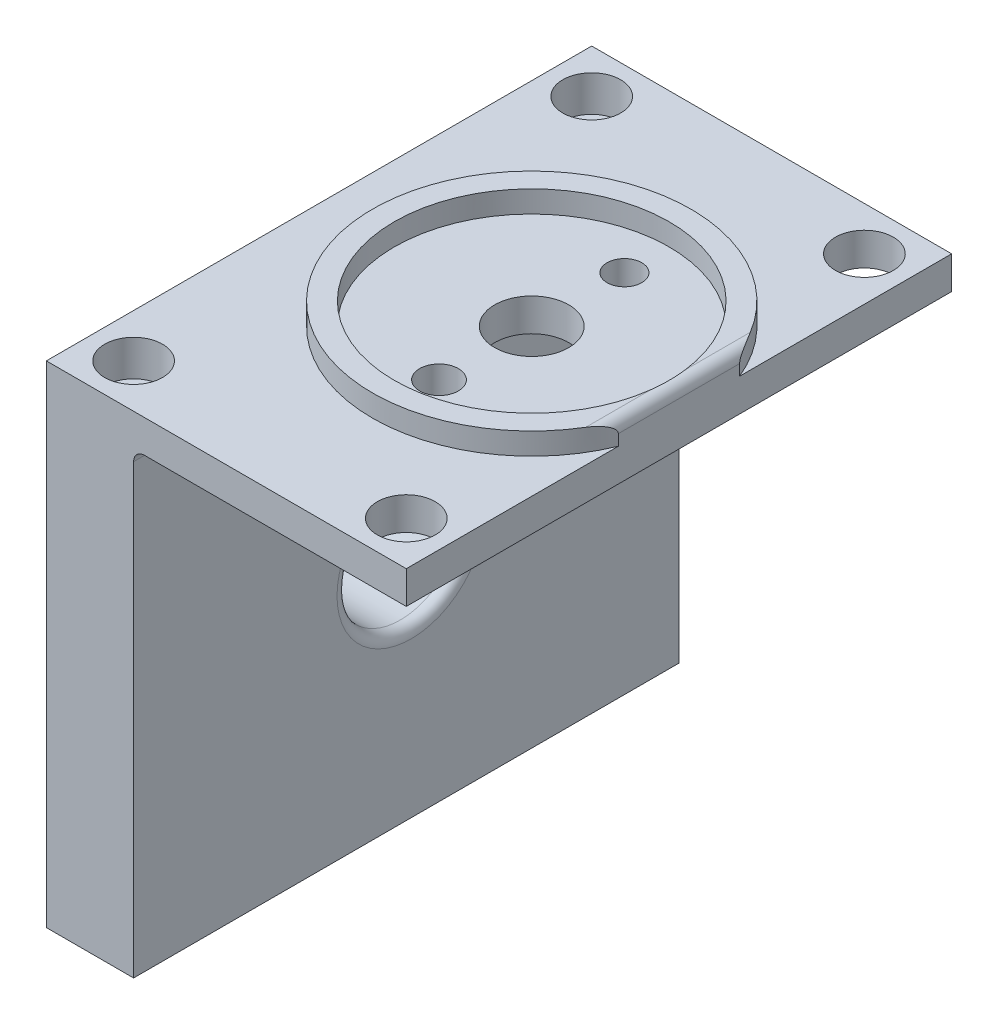
ISO-10303-21;
HEADER;
FILE_DESCRIPTION(('STEP AP214'),'2;1');
FILE_NAME('part.step','',(''),(''),'','','');
FILE_SCHEMA(('AUTOMOTIVE_DESIGN { 1 0 10303 214 1 1 1 1 }'));
ENDSEC;
DATA;
#1=APPLICATION_CONTEXT('core data for automotive mechanical design processes');
#2=APPLICATION_PROTOCOL_DEFINITION('international standard','automotive_design',2000,#1);
#3=PRODUCT_CONTEXT('',#1,'mechanical');
#4=PRODUCT('Part','Part','',(#3));
#5=PRODUCT_RELATED_PRODUCT_CATEGORY('part','',(#4));
#6=PRODUCT_DEFINITION_FORMATION('','',#4);
#7=PRODUCT_DEFINITION_CONTEXT('part definition',#1,'design');
#8=PRODUCT_DEFINITION('design','',#6,#7);
#9=PRODUCT_DEFINITION_SHAPE('','',#8);
#10=(LENGTH_UNIT() NAMED_UNIT(*) SI_UNIT(.MILLI.,.METRE.));
#11=(NAMED_UNIT(*) PLANE_ANGLE_UNIT() SI_UNIT($,.RADIAN.));
#12=(NAMED_UNIT(*) SI_UNIT($,.STERADIAN.) SOLID_ANGLE_UNIT());
#13=UNCERTAINTY_MEASURE_WITH_UNIT(LENGTH_MEASURE(1.E-05),#10,'distance_accuracy_value','');
#14=(GEOMETRIC_REPRESENTATION_CONTEXT(3) GLOBAL_UNCERTAINTY_ASSIGNED_CONTEXT((#13)) GLOBAL_UNIT_ASSIGNED_CONTEXT((#10,
#11,#12)) REPRESENTATION_CONTEXT('',''));
#15=CARTESIAN_POINT('',(0.,0.,0.));
#16=DIRECTION('',(0.,0.,1.));
#17=DIRECTION('',(1.,0.,0.));
#18=AXIS2_PLACEMENT_3D('',#15,#16,#17);
#19=CARTESIAN_POINT('',(0.,3.,0.));
#20=DIRECTION('',(0.,1.,0.));
#21=DIRECTION('',(0.,0.,1.));
#22=AXIS2_PLACEMENT_3D('',#19,#20,#21);
#23=PLANE('',#22);
#24=CARTESIAN_POINT('',(1.27695167286245,3.,-19.8847583643123));
#25=DIRECTION('',(0.,1.,0.));
#26=DIRECTION('',(0.,0.,1.));
#27=AXIS2_PLACEMENT_3D('',#24,#25,#26);
#28=CIRCLE('',#27,1.58978016760219);
#29=CARTESIAN_POINT('',(1.27695167286245,3.,-18.2949781967101));
#30=VERTEX_POINT('',#29);
#31=EDGE_CURVE('E376',#30,#30,#28,.T.);
#32=ORIENTED_EDGE('',*,*,#31,.F.);
#33=EDGE_LOOP('',(#32));
#34=FACE_BOUND('',#33,.T.);
#35=CARTESIAN_POINT('',(1.27695167286245,3.,-2.88475836431227));
#36=DIRECTION('',(0.,1.,0.));
#37=DIRECTION('',(0.,0.,1.));
#38=AXIS2_PLACEMENT_3D('',#35,#36,#37);
#39=CIRCLE('',#38,1.77742826201975);
#40=CARTESIAN_POINT('',(1.27695167286245,3.,-1.10733010229252));
#41=VERTEX_POINT('',#40);
#42=EDGE_CURVE('E380',#41,#41,#39,.T.);
#43=ORIENTED_EDGE('',*,*,#42,.F.);
#44=EDGE_LOOP('',(#43));
#45=FACE_BOUND('',#44,.T.);
#46=CARTESIAN_POINT('',(1.27695167286245,3.,-11.3847583643123));
#47=DIRECTION('',(0.,1.,0.));
#48=DIRECTION('',(0.,0.,1.));
#49=AXIS2_PLACEMENT_3D('',#46,#47,#48);
#50=CIRCLE('',#49,3.4);
#51=CARTESIAN_POINT('',(1.27695167286245,3.,-7.98475836431227));
#52=VERTEX_POINT('',#51);
#53=EDGE_CURVE('E218',#52,#52,#50,.T.);
#54=ORIENTED_EDGE('',*,*,#53,.F.);
#55=EDGE_LOOP('',(#54));
#56=FACE_BOUND('',#55,.T.);
#57=CARTESIAN_POINT('',(1.27695167286245,3.,-11.3847583643123));
#58=DIRECTION('',(0.,1.,0.));
#59=DIRECTION('',(0.,0.,1.));
#60=AXIS2_PLACEMENT_3D('',#57,#58,#59);
#61=CIRCLE('',#60,12.6);
#62=CARTESIAN_POINT('',(1.27695167286245,3.,1.21524163568773));
#63=VERTEX_POINT('',#62);
#64=EDGE_CURVE('E145',#63,#63,#61,.T.);
#65=ORIENTED_EDGE('',*,*,#64,.T.);
#66=EDGE_LOOP('',(#65));
#67=FACE_BOUND('',#66,.T.);
#68=ADVANCED_FACE('F39',(#34,#45,#56,#67),#23,.T.);
#69=CARTESIAN_POINT('',(0.,0.,0.));
#70=DIRECTION('',(0.,1.,0.));
#71=DIRECTION('',(0.,0.,1.));
#72=AXIS2_PLACEMENT_3D('',#69,#70,#71);
#73=PLANE('',#72);
#74=CARTESIAN_POINT('',(1.27695167286245,0.,-19.8847583643123));
#75=DIRECTION('',(0.,1.,0.));
#76=DIRECTION('',(0.,0.,1.));
#77=AXIS2_PLACEMENT_3D('',#74,#75,#76);
#78=CIRCLE('',#77,1.58978016760219);
#79=CARTESIAN_POINT('',(1.27695167286245,0.,-18.2949781967101));
#80=VERTEX_POINT('',#79);
#81=EDGE_CURVE('E44',#80,#80,#78,.T.);
#82=ORIENTED_EDGE('',*,*,#81,.T.);
#83=EDGE_LOOP('',(#82));
#84=FACE_BOUND('',#83,.T.);
#85=CARTESIAN_POINT('',(1.27695167286245,0.,-2.88475836431227));
#86=DIRECTION('',(0.,1.,0.));
#87=DIRECTION('',(0.,0.,1.));
#88=AXIS2_PLACEMENT_3D('',#85,#86,#87);
#89=CIRCLE('',#88,1.77742826201975);
#90=CARTESIAN_POINT('',(1.27695167286245,0.,-1.10733010229252));
#91=VERTEX_POINT('',#90);
#92=EDGE_CURVE('E413',#91,#91,#89,.T.);
#93=ORIENTED_EDGE('',*,*,#92,.T.);
#94=EDGE_LOOP('',(#93));
#95=FACE_BOUND('',#94,.T.);
#96=CARTESIAN_POINT('',(10.7769516728624,0.,-32.3847583643123));
#97=DIRECTION('',(0.,1.,0.));
#98=DIRECTION('',(0.,0.,1.));
#99=AXIS2_PLACEMENT_3D('',#96,#97,#98);
#100=CIRCLE('',#99,2.65);
#101=CARTESIAN_POINT('',(10.7769516728624,0.,-29.7347583643123));
#102=VERTEX_POINT('',#101);
#103=EDGE_CURVE('E163',#102,#102,#100,.F.);
#104=ORIENTED_EDGE('',*,*,#103,.F.);
#105=EDGE_LOOP('',(#104));
#106=FACE_BOUND('',#105,.T.);
#107=CARTESIAN_POINT('',(10.7769516728625,0.,9.61524163568773));
#108=DIRECTION('',(0.,1.,0.));
#109=DIRECTION('',(0.,0.,1.));
#110=AXIS2_PLACEMENT_3D('',#107,#108,#109);
#111=CIRCLE('',#110,2.65);
#112=CARTESIAN_POINT('',(10.7769516728625,0.,12.2652416356877));
#113=VERTEX_POINT('',#112);
#114=EDGE_CURVE('E158',#113,#113,#111,.F.);
#115=ORIENTED_EDGE('',*,*,#114,.F.);
#116=EDGE_LOOP('',(#115));
#117=FACE_BOUND('',#116,.T.);
#118=CARTESIAN_POINT('',(1.27695167286245,0.,-11.3847583643123));
#119=DIRECTION('',(0.,1.,0.));
#120=DIRECTION('',(0.,0.,1.));
#121=AXIS2_PLACEMENT_3D('',#118,#119,#120);
#122=CIRCLE('',#121,3.4);
#123=CARTESIAN_POINT('',(1.27695167286245,0.,-7.98475836431227));
#124=VERTEX_POINT('',#123);
#125=EDGE_CURVE('E217',#124,#124,#122,.T.);
#126=ORIENTED_EDGE('',*,*,#125,.T.);
#127=EDGE_LOOP('',(#126));
#128=FACE_BOUND('',#127,.T.);
#129=DIRECTION('',(1.,0.,0.));
#130=VECTOR('',#129,1.);
#131=CARTESIAN_POINT('',(-10.2230483271375,0.,13.6152416356877));
#132=LINE('',#131,#130);
#133=CARTESIAN_POINT('',(-9.22304832713755,0.,13.6152416356877));
#134=VERTEX_POINT('',#133);
#135=CARTESIAN_POINT('',(14.7769516728625,0.,13.6152416356877));
#136=VERTEX_POINT('',#135);
#137=EDGE_CURVE('E221',#134,#136,#132,.T.);
#138=ORIENTED_EDGE('',*,*,#137,.F.);
#139=DIRECTION('',(0.,0.,1.));
#140=VECTOR('',#139,1.);
#141=CARTESIAN_POINT('',(-9.22304832713755,0.,-36.3847583643123));
#142=LINE('',#141,#140);
#143=CARTESIAN_POINT('',(-9.22304832713755,0.,-36.3847583643123));
#144=VERTEX_POINT('',#143);
#145=EDGE_CURVE('E246',#134,#144,#142,.F.);
#146=ORIENTED_EDGE('',*,*,#145,.T.);
#147=DIRECTION('',(-1.,0.,0.));
#148=VECTOR('',#147,1.);
#149=CARTESIAN_POINT('',(-10.2230483271376,0.,-36.3847583643123));
#150=LINE('',#149,#148);
#151=CARTESIAN_POINT('',(14.7769516728625,0.,-36.3847583643123));
#152=VERTEX_POINT('',#151);
#153=EDGE_CURVE('E224',#152,#144,#150,.T.);
#154=ORIENTED_EDGE('',*,*,#153,.F.);
#155=DIRECTION('',(0.,0.,-1.));
#156=VECTOR('',#155,1.);
#157=CARTESIAN_POINT('',(14.7769516728625,0.,-36.3847583643123));
#158=LINE('',#157,#156);
#159=EDGE_CURVE('E229',#136,#152,#158,.T.);
#160=ORIENTED_EDGE('',*,*,#159,.F.);
#161=EDGE_LOOP('',(#138,#146,#154,#160));
#162=FACE_BOUND('',#161,.T.);
#163=ADVANCED_FACE('F343',(#84,#95,#106,#117,#128,#162),#73,.F.);
#164=CARTESIAN_POINT('',(1.27695167286245,3.,-11.3847583643123));
#165=DIRECTION('',(0.,1.,0.));
#166=DIRECTION('',(0.,0.,1.));
#167=AXIS2_PLACEMENT_3D('',#164,#165,#166);
#168=CIRCLE('',#167,14.6);
#169=CARTESIAN_POINT('',(14.7769516728625,3.,-16.9444346138793));
#170=VERTEX_POINT('',#169);
#171=CARTESIAN_POINT('',(14.7769516728625,3.,-5.82508211474523));
#172=VERTEX_POINT('',#171);
#173=EDGE_CURVE('E135',#170,#172,#168,.T.);
#174=ORIENTED_EDGE('',*,*,#173,.F.);
#175=DIRECTION('',(0.,0.,-1.));
#176=VECTOR('',#175,1.);
#177=CARTESIAN_POINT('',(14.7769516728625,3.,-36.3847583643123));
#178=LINE('',#177,#176);
#179=CARTESIAN_POINT('',(14.7769516728625,3.,-36.3847583643123));
#180=VERTEX_POINT('',#179);
#181=EDGE_CURVE('E141',#170,#180,#178,.T.);
#182=ORIENTED_EDGE('',*,*,#181,.T.);
#183=DIRECTION('',(-1.,0.,0.));
#184=VECTOR('',#183,1.);
#185=CARTESIAN_POINT('',(-10.2230483271376,3.,-36.3847583643123));
#186=LINE('',#185,#184);
#187=CARTESIAN_POINT('',(-18.2230483271376,3.,-36.3847583643123));
#188=VERTEX_POINT('',#187);
#189=EDGE_CURVE('E140',#180,#188,#186,.T.);
#190=ORIENTED_EDGE('',*,*,#189,.T.);
#191=DIRECTION('',(0.,0.,-1.));
#192=VECTOR('',#191,1.);
#193=CARTESIAN_POINT('',(-18.2230483271376,3.,-36.3847583643123));
#194=LINE('',#193,#192);
#195=CARTESIAN_POINT('',(-18.2230483271375,3.,13.6152416356877));
#196=VERTEX_POINT('',#195);
#197=EDGE_CURVE('E214',#196,#188,#194,.T.);
#198=ORIENTED_EDGE('',*,*,#197,.F.);
#199=DIRECTION('',(1.,0.,0.));
#200=VECTOR('',#199,1.);
#201=CARTESIAN_POINT('',(-10.2230483271375,3.,13.6152416356877));
#202=LINE('',#201,#200);
#203=CARTESIAN_POINT('',(14.7769516728625,3.,13.6152416356877));
#204=VERTEX_POINT('',#203);
#205=EDGE_CURVE('E138',#196,#204,#202,.T.);
#206=ORIENTED_EDGE('',*,*,#205,.T.);
#207=EDGE_CURVE('E125',#204,#172,#178,.T.);
#208=ORIENTED_EDGE('',*,*,#207,.T.);
#209=EDGE_LOOP('',(#174,#182,#190,#198,#206,#208));
#210=FACE_BOUND('',#209,.T.);
#211=CARTESIAN_POINT('',(10.7769516728624,3.,-32.3847583643123));
#212=DIRECTION('',(0.,-1.,0.));
#213=DIRECTION('',(0.,0.,1.));
#214=AXIS2_PLACEMENT_3D('',#211,#212,#213);
#215=CIRCLE('',#214,2.65);
#216=CARTESIAN_POINT('',(10.7769516728624,3.,-29.7347583643123));
#217=VERTEX_POINT('',#216);
#218=EDGE_CURVE('E155',#217,#217,#215,.T.);
#219=ORIENTED_EDGE('',*,*,#218,.T.);
#220=EDGE_LOOP('',(#219));
#221=FACE_BOUND('',#220,.T.);
#222=CARTESIAN_POINT('',(10.7769516728625,3.,9.61524163568773));
#223=DIRECTION('',(0.,-1.,0.));
#224=DIRECTION('',(0.,0.,1.));
#225=AXIS2_PLACEMENT_3D('',#222,#223,#224);
#226=CIRCLE('',#225,2.65);
#227=CARTESIAN_POINT('',(10.7769516728625,3.,12.2652416356877));
#228=VERTEX_POINT('',#227);
#229=EDGE_CURVE('E154',#228,#228,#226,.T.);
#230=ORIENTED_EDGE('',*,*,#229,.T.);
#231=EDGE_LOOP('',(#230));
#232=FACE_BOUND('',#231,.T.);
#233=CARTESIAN_POINT('',(-14.2230483271375,3.,-32.3847583643123));
#234=DIRECTION('',(0.,1.,0.));
#235=DIRECTION('',(0.,0.,1.));
#236=AXIS2_PLACEMENT_3D('',#233,#234,#235);
#237=CIRCLE('',#236,2.65);
#238=CARTESIAN_POINT('',(-14.2230483271375,3.,-29.7347583643123));
#239=VERTEX_POINT('',#238);
#240=EDGE_CURVE('E186',#239,#239,#237,.T.);
#241=ORIENTED_EDGE('',*,*,#240,.F.);
#242=EDGE_LOOP('',(#241));
#243=FACE_BOUND('',#242,.T.);
#244=CARTESIAN_POINT('',(-14.2230483271375,3.,9.61524163568773));
#245=DIRECTION('',(0.,1.,0.));
#246=DIRECTION('',(0.,0.,1.));
#247=AXIS2_PLACEMENT_3D('',#244,#245,#246);
#248=CIRCLE('',#247,2.65);
#249=CARTESIAN_POINT('',(-14.2230483271375,3.,12.2652416356877));
#250=VERTEX_POINT('',#249);
#251=EDGE_CURVE('E173',#250,#250,#248,.T.);
#252=ORIENTED_EDGE('',*,*,#251,.F.);
#253=EDGE_LOOP('',(#252));
#254=FACE_BOUND('',#253,.T.);
#255=ADVANCED_FACE('F133',(#210,#221,#232,#243,#254),#23,.T.);
#256=CARTESIAN_POINT('',(-10.2230483271375,3.,13.6152416356877));
#257=DIRECTION('',(0.,0.,-1.));
#258=DIRECTION('',(-1.,0.,0.));
#259=AXIS2_PLACEMENT_3D('',#256,#257,#258);
#260=PLANE('',#259);
#261=DIRECTION('',(0.,1.,0.));
#262=VECTOR('',#261,1.);
#263=CARTESIAN_POINT('',(-18.2230483271375,3.,13.6152416356877));
#264=LINE('',#263,#262);
#265=CARTESIAN_POINT('',(-18.2230483271376,-42.,13.6152416356877));
#266=VERTEX_POINT('',#265);
#267=EDGE_CURVE('E211',#266,#196,#264,.T.);
#268=ORIENTED_EDGE('',*,*,#267,.F.);
#269=DIRECTION('',(-1.,0.,0.));
#270=VECTOR('',#269,1.);
#271=CARTESIAN_POINT('',(-18.2230483271376,-42.,13.6152416356877));
#272=LINE('',#271,#270);
#273=CARTESIAN_POINT('',(-10.2230483271376,-42.,13.6152416356877));
#274=VERTEX_POINT('',#273);
#275=EDGE_CURVE('E200',#274,#266,#272,.T.);
#276=ORIENTED_EDGE('',*,*,#275,.F.);
#277=DIRECTION('',(0.,1.,0.));
#278=VECTOR('',#277,1.);
#279=CARTESIAN_POINT('',(-10.2230483271376,-42.,13.6152416356877));
#280=LINE('',#279,#278);
#281=CARTESIAN_POINT('',(-10.2230483271376,-1.00000000000001,13.6152416356877));
#282=VERTEX_POINT('',#281);
#283=EDGE_CURVE('E203',#274,#282,#280,.T.);
#284=ORIENTED_EDGE('',*,*,#283,.T.);
#285=CARTESIAN_POINT('',(-9.22304832713755,-1.,13.6152416356877));
#286=DIRECTION('',(0.,0.,-1.));
#287=DIRECTION('',(-1.,0.,0.));
#288=AXIS2_PLACEMENT_3D('',#285,#286,#287);
#289=CIRCLE('',#288,1.);
#290=EDGE_CURVE('E248',#282,#134,#289,.T.);
#291=ORIENTED_EDGE('',*,*,#290,.T.);
#292=ORIENTED_EDGE('',*,*,#137,.T.);
#293=DIRECTION('',(0.,-1.,0.));
#294=VECTOR('',#293,1.);
#295=CARTESIAN_POINT('',(14.7769516728625,3.,13.6152416356877));
#296=LINE('',#295,#294);
#297=EDGE_CURVE('E235',#204,#136,#296,.T.);
#298=ORIENTED_EDGE('',*,*,#297,.F.);
#299=ORIENTED_EDGE('',*,*,#205,.F.);
#300=EDGE_LOOP('',(#268,#276,#284,#291,#292,#298,#299));
#301=FACE_BOUND('',#300,.T.);
#302=ADVANCED_FACE('F342',(#301),#260,.F.);
#303=CARTESIAN_POINT('',(14.7769516728625,3.,-36.3847583643123));
#304=DIRECTION('',(-1.,0.,0.));
#305=DIRECTION('',(0.,0.,1.));
#306=AXIS2_PLACEMENT_3D('',#303,#304,#305);
#307=PLANE('',#306);
#308=DIRECTION('',(0.,-1.,0.));
#309=VECTOR('',#308,1.);
#310=CARTESIAN_POINT('',(14.7769516728625,5.,-16.9444346138793));
#311=LINE('',#310,#309);
#312=CARTESIAN_POINT('',(14.7769516728625,4.,-16.9444346138793));
#313=VERTEX_POINT('',#312);
#314=EDGE_CURVE('E128',#313,#170,#311,.T.);
#315=ORIENTED_EDGE('',*,*,#314,.F.);
#316=DIRECTION('',(0.,0.,-1.));
#317=VECTOR('',#316,1.);
#318=CARTESIAN_POINT('',(14.7769516728625,4.,-5.82508211474523));
#319=LINE('',#318,#317);
#320=CARTESIAN_POINT('',(14.7769516728625,4.,-5.82508211474523));
#321=VERTEX_POINT('',#320);
#322=EDGE_CURVE('E11',#313,#321,#319,.F.);
#323=ORIENTED_EDGE('',*,*,#322,.T.);
#324=DIRECTION('',(0.,-1.,0.));
#325=VECTOR('',#324,1.);
#326=CARTESIAN_POINT('',(14.7769516728625,5.,-5.82508211474523));
#327=LINE('',#326,#325);
#328=EDGE_CURVE('E121',#321,#172,#327,.T.);
#329=ORIENTED_EDGE('',*,*,#328,.T.);
#330=ORIENTED_EDGE('',*,*,#207,.F.);
#331=ORIENTED_EDGE('',*,*,#297,.T.);
#332=ORIENTED_EDGE('',*,*,#159,.T.);
#333=DIRECTION('',(0.,-1.,0.));
#334=VECTOR('',#333,1.);
#335=CARTESIAN_POINT('',(14.7769516728625,3.,-36.3847583643123));
#336=LINE('',#335,#334);
#337=EDGE_CURVE('E227',#180,#152,#336,.T.);
#338=ORIENTED_EDGE('',*,*,#337,.F.);
#339=ORIENTED_EDGE('',*,*,#181,.F.);
#340=EDGE_LOOP('',(#315,#323,#329,#330,#331,#332,#338,#339));
#341=FACE_BOUND('',#340,.T.);
#342=ADVANCED_FACE('F123',(#341),#307,.F.);
#343=CARTESIAN_POINT('',(-10.2230483271376,3.,-36.3847583643123));
#344=DIRECTION('',(0.,0.,1.));
#345=DIRECTION('',(1.,0.,0.));
#346=AXIS2_PLACEMENT_3D('',#343,#344,#345);
#347=PLANE('',#346);
#348=ORIENTED_EDGE('',*,*,#153,.T.);
#349=CARTESIAN_POINT('',(-9.22304832713755,-1.,-36.3847583643123));
#350=DIRECTION('',(0.,0.,1.));
#351=DIRECTION('',(1.,0.,0.));
#352=AXIS2_PLACEMENT_3D('',#349,#350,#351);
#353=CIRCLE('',#352,1.);
#354=CARTESIAN_POINT('',(-10.2230483271376,-1.00000000000001,-36.3847583643123));
#355=VERTEX_POINT('',#354);
#356=EDGE_CURVE('E250',#144,#355,#353,.T.);
#357=ORIENTED_EDGE('',*,*,#356,.T.);
#358=DIRECTION('',(0.,1.,0.));
#359=VECTOR('',#358,1.);
#360=CARTESIAN_POINT('',(-10.2230483271376,-42.,-36.3847583643123));
#361=LINE('',#360,#359);
#362=CARTESIAN_POINT('',(-10.2230483271376,-42.,-36.3847583643123));
#363=VERTEX_POINT('',#362);
#364=EDGE_CURVE('E206',#363,#355,#361,.T.);
#365=ORIENTED_EDGE('',*,*,#364,.F.);
#366=DIRECTION('',(1.,0.,0.));
#367=VECTOR('',#366,1.);
#368=CARTESIAN_POINT('',(-18.2230483271376,-42.,-36.3847583643123));
#369=LINE('',#368,#367);
#370=CARTESIAN_POINT('',(-18.2230483271376,-42.,-36.3847583643123));
#371=VERTEX_POINT('',#370);
#372=EDGE_CURVE('E196',#371,#363,#369,.T.);
#373=ORIENTED_EDGE('',*,*,#372,.F.);
#374=DIRECTION('',(0.,-1.,0.));
#375=VECTOR('',#374,1.);
#376=CARTESIAN_POINT('',(-18.2230483271376,3.,-36.3847583643123));
#377=LINE('',#376,#375);
#378=EDGE_CURVE('E209',#188,#371,#377,.T.);
#379=ORIENTED_EDGE('',*,*,#378,.F.);
#380=ORIENTED_EDGE('',*,*,#189,.F.);
#381=ORIENTED_EDGE('',*,*,#337,.T.);
#382=EDGE_LOOP('',(#348,#357,#365,#373,#379,#380,#381));
#383=FACE_BOUND('',#382,.T.);
#384=ADVANCED_FACE('F338',(#383),#347,.F.);
#385=CARTESIAN_POINT('',(1.27695167286245,3.,-11.3847583643123));
#386=DIRECTION('',(0.,-1.,0.));
#387=DIRECTION('',(0.,0.,-1.));
#388=AXIS2_PLACEMENT_3D('',#385,#386,#387);
#389=CYLINDRICAL_SURFACE('',#388,3.4);
#390=ORIENTED_EDGE('',*,*,#53,.T.);
#391=EDGE_LOOP('',(#390));
#392=FACE_BOUND('',#391,.T.);
#393=ORIENTED_EDGE('',*,*,#125,.F.);
#394=EDGE_LOOP('',(#393));
#395=FACE_BOUND('',#394,.T.);
#396=ADVANCED_FACE('F334',(#392,#395),#389,.F.);
#397=CARTESIAN_POINT('',(-18.2230483271375,0.,0.));
#398=DIRECTION('',(-1.,0.,0.));
#399=DIRECTION('',(0.,0.,1.));
#400=AXIS2_PLACEMENT_3D('',#397,#398,#399);
#401=PLANE('',#400);
#402=CARTESIAN_POINT('',(-18.2230483271375,-21.,-11.836279123996));
#403=DIRECTION('',(-1.,0.,0.));
#404=DIRECTION('',(0.,0.,1.));
#405=AXIS2_PLACEMENT_3D('',#402,#403,#404);
#406=CIRCLE('',#405,5.80237020535575);
#407=CARTESIAN_POINT('',(-18.2230483271375,-21.,-6.03390891864026));
#408=VERTEX_POINT('',#407);
#409=EDGE_CURVE('E166',#408,#408,#406,.T.);
#410=ORIENTED_EDGE('',*,*,#409,.F.);
#411=EDGE_LOOP('',(#410));
#412=FACE_BOUND('',#411,.T.);
#413=ORIENTED_EDGE('',*,*,#378,.T.);
#414=DIRECTION('',(0.,0.,-1.));
#415=VECTOR('',#414,1.);
#416=CARTESIAN_POINT('',(-18.2230483271376,-42.,-36.3847583643123));
#417=LINE('',#416,#415);
#418=EDGE_CURVE('E185',#266,#371,#417,.T.);
#419=ORIENTED_EDGE('',*,*,#418,.F.);
#420=ORIENTED_EDGE('',*,*,#267,.T.);
#421=ORIENTED_EDGE('',*,*,#197,.T.);
#422=EDGE_LOOP('',(#413,#419,#420,#421));
#423=FACE_BOUND('',#422,.T.);
#424=ADVANCED_FACE('F330',(#412,#423),#401,.T.);
#425=CARTESIAN_POINT('',(-10.2230483271376,-42.,-36.3847583643123));
#426=DIRECTION('',(-1.,0.,0.));
#427=DIRECTION('',(0.,0.,1.));
#428=AXIS2_PLACEMENT_3D('',#425,#426,#427);
#429=PLANE('',#428);
#430=CARTESIAN_POINT('',(-10.2230483271376,-21.,-11.836279123996));
#431=DIRECTION('',(-1.,0.,0.));
#432=DIRECTION('',(0.,0.,1.));
#433=AXIS2_PLACEMENT_3D('',#430,#431,#432);
#434=CIRCLE('',#433,6.80237020535575);
#435=CARTESIAN_POINT('',(-10.2230483271376,-21.,-5.03390891864026));
#436=VERTEX_POINT('',#435);
#437=EDGE_CURVE('E237',#436,#436,#434,.T.);
#438=ORIENTED_EDGE('',*,*,#437,.T.);
#439=EDGE_LOOP('',(#438));
#440=FACE_BOUND('',#439,.T.);
#441=ORIENTED_EDGE('',*,*,#364,.T.);
#442=DIRECTION('',(0.,0.,1.));
#443=VECTOR('',#442,1.);
#444=CARTESIAN_POINT('',(-10.2230483271376,-1.,13.6152416356877));
#445=LINE('',#444,#443);
#446=EDGE_CURVE('E243',#355,#282,#445,.T.);
#447=ORIENTED_EDGE('',*,*,#446,.T.);
#448=ORIENTED_EDGE('',*,*,#283,.F.);
#449=DIRECTION('',(0.,0.,1.));
#450=VECTOR('',#449,1.);
#451=CARTESIAN_POINT('',(-10.2230483271376,-42.,-36.3847583643123));
#452=LINE('',#451,#450);
#453=EDGE_CURVE('E198',#363,#274,#452,.T.);
#454=ORIENTED_EDGE('',*,*,#453,.F.);
#455=EDGE_LOOP('',(#441,#447,#448,#454));
#456=FACE_BOUND('',#455,.T.);
#457=ADVANCED_FACE('F326',(#440,#456),#429,.F.);
#458=CARTESIAN_POINT('',(0.,-42.,0.));
#459=DIRECTION('',(0.,1.,0.));
#460=DIRECTION('',(0.,0.,1.));
#461=AXIS2_PLACEMENT_3D('',#458,#459,#460);
#462=PLANE('',#461);
#463=CARTESIAN_POINT('',(-14.2230483271375,-42.,-32.3847583643123));
#464=DIRECTION('',(0.,1.,0.));
#465=DIRECTION('',(0.,0.,1.));
#466=AXIS2_PLACEMENT_3D('',#463,#464,#465);
#467=CIRCLE('',#466,2.65);
#468=CARTESIAN_POINT('',(-14.2230483271375,-42.,-29.7347583643123));
#469=VERTEX_POINT('',#468);
#470=EDGE_CURVE('E174',#469,#469,#467,.T.);
#471=ORIENTED_EDGE('',*,*,#470,.T.);
#472=EDGE_LOOP('',(#471));
#473=FACE_BOUND('',#472,.T.);
#474=CARTESIAN_POINT('',(-14.2230483271375,-42.,9.61524163568773));
#475=DIRECTION('',(0.,1.,0.));
#476=DIRECTION('',(0.,0.,1.));
#477=AXIS2_PLACEMENT_3D('',#474,#475,#476);
#478=CIRCLE('',#477,2.65);
#479=CARTESIAN_POINT('',(-14.2230483271375,-42.,12.2652416356877));
#480=VERTEX_POINT('',#479);
#481=EDGE_CURVE('E169',#480,#480,#478,.T.);
#482=ORIENTED_EDGE('',*,*,#481,.T.);
#483=EDGE_LOOP('',(#482));
#484=FACE_BOUND('',#483,.T.);
#485=ORIENTED_EDGE('',*,*,#418,.T.);
#486=ORIENTED_EDGE('',*,*,#372,.T.);
#487=ORIENTED_EDGE('',*,*,#453,.T.);
#488=ORIENTED_EDGE('',*,*,#275,.T.);
#489=EDGE_LOOP('',(#485,#486,#487,#488));
#490=FACE_BOUND('',#489,.T.);
#491=ADVANCED_FACE('F322',(#473,#484,#490),#462,.F.);
#492=CARTESIAN_POINT('',(-14.2230483271375,-0.3,9.61524163568773));
#493=DIRECTION('',(0.,1.,0.));
#494=DIRECTION('',(0.,0.,1.));
#495=AXIS2_PLACEMENT_3D('',#492,#493,#494);
#496=CYLINDRICAL_SURFACE('',#495,2.65);
#497=CARTESIAN_POINT('',(-14.2230483271375,-0.3,9.61524163568773));
#498=DIRECTION('',(0.,1.,0.));
#499=DIRECTION('',(0.,0.,1.));
#500=AXIS2_PLACEMENT_3D('',#497,#498,#499);
#501=CIRCLE('',#500,2.65);
#502=CARTESIAN_POINT('',(-14.2230483271375,-0.3,12.2652416356877));
#503=VERTEX_POINT('',#502);
#504=EDGE_CURVE('E189',#503,#503,#501,.T.);
#505=ORIENTED_EDGE('',*,*,#504,.F.);
#506=EDGE_LOOP('',(#505));
#507=FACE_BOUND('',#506,.T.);
#508=ORIENTED_EDGE('',*,*,#251,.T.);
#509=EDGE_LOOP('',(#508));
#510=FACE_BOUND('',#509,.T.);
#511=ADVANCED_FACE('F318',(#507,#510),#496,.F.);
#512=CARTESIAN_POINT('',(-14.2230483271375,-0.3,9.61524163568773));
#513=DIRECTION('',(0.,1.,0.));
#514=DIRECTION('',(0.,0.,1.));
#515=AXIS2_PLACEMENT_3D('',#512,#513,#514);
#516=PLANE('',#515);
#517=ORIENTED_EDGE('',*,*,#504,.T.);
#518=EDGE_LOOP('',(#517));
#519=FACE_BOUND('',#518,.T.);
#520=ADVANCED_FACE('F314',(#519),#516,.T.);
#521=CARTESIAN_POINT('',(-14.2230483271375,-0.3,-32.3847583643123));
#522=DIRECTION('',(0.,1.,0.));
#523=DIRECTION('',(0.,0.,1.));
#524=AXIS2_PLACEMENT_3D('',#521,#522,#523);
#525=CYLINDRICAL_SURFACE('',#524,2.65);
#526=CARTESIAN_POINT('',(-14.2230483271375,-0.3,-32.3847583643123));
#527=DIRECTION('',(0.,1.,0.));
#528=DIRECTION('',(0.,0.,1.));
#529=AXIS2_PLACEMENT_3D('',#526,#527,#528);
#530=CIRCLE('',#529,2.65);
#531=CARTESIAN_POINT('',(-14.2230483271375,-0.3,-29.7347583643123));
#532=VERTEX_POINT('',#531);
#533=EDGE_CURVE('E182',#532,#532,#530,.T.);
#534=ORIENTED_EDGE('',*,*,#533,.F.);
#535=EDGE_LOOP('',(#534));
#536=FACE_BOUND('',#535,.T.);
#537=ORIENTED_EDGE('',*,*,#240,.T.);
#538=EDGE_LOOP('',(#537));
#539=FACE_BOUND('',#538,.T.);
#540=ADVANCED_FACE('F310',(#536,#539),#525,.F.);
#541=CARTESIAN_POINT('',(-14.2230483271375,-0.3,-32.3847583643123));
#542=DIRECTION('',(0.,1.,0.));
#543=DIRECTION('',(0.,0.,1.));
#544=AXIS2_PLACEMENT_3D('',#541,#542,#543);
#545=PLANE('',#544);
#546=ORIENTED_EDGE('',*,*,#533,.T.);
#547=EDGE_LOOP('',(#546));
#548=FACE_BOUND('',#547,.T.);
#549=ADVANCED_FACE('F306',(#548),#545,.T.);
#550=CARTESIAN_POINT('',(-14.2230483271375,-38.7,9.61524163568773));
#551=DIRECTION('',(0.,-1.,0.));
#552=DIRECTION('',(0.,0.,-1.));
#553=AXIS2_PLACEMENT_3D('',#550,#551,#552);
#554=CYLINDRICAL_SURFACE('',#553,2.65);
#555=CARTESIAN_POINT('',(-14.2230483271375,-38.7,9.61524163568773));
#556=DIRECTION('',(0.,1.,0.));
#557=DIRECTION('',(0.,0.,1.));
#558=AXIS2_PLACEMENT_3D('',#555,#556,#557);
#559=CIRCLE('',#558,2.65);
#560=CARTESIAN_POINT('',(-14.2230483271375,-38.7,12.2652416356877));
#561=VERTEX_POINT('',#560);
#562=EDGE_CURVE('E177',#561,#561,#559,.T.);
#563=ORIENTED_EDGE('',*,*,#562,.T.);
#564=EDGE_LOOP('',(#563));
#565=FACE_BOUND('',#564,.T.);
#566=ORIENTED_EDGE('',*,*,#481,.F.);
#567=EDGE_LOOP('',(#566));
#568=FACE_BOUND('',#567,.T.);
#569=ADVANCED_FACE('F302',(#565,#568),#554,.F.);
#570=CARTESIAN_POINT('',(-14.2230483271375,-38.7,9.61524163568773));
#571=DIRECTION('',(0.,-1.,0.));
#572=DIRECTION('',(0.,0.,1.));
#573=AXIS2_PLACEMENT_3D('',#570,#571,#572);
#574=PLANE('',#573);
#575=ORIENTED_EDGE('',*,*,#562,.F.);
#576=EDGE_LOOP('',(#575));
#577=FACE_BOUND('',#576,.T.);
#578=ADVANCED_FACE('F298',(#577),#574,.T.);
#579=CARTESIAN_POINT('',(-14.2230483271375,-38.7,-32.3847583643123));
#580=DIRECTION('',(0.,-1.,0.));
#581=DIRECTION('',(0.,0.,-1.));
#582=AXIS2_PLACEMENT_3D('',#579,#580,#581);
#583=CYLINDRICAL_SURFACE('',#582,2.65);
#584=CARTESIAN_POINT('',(-14.2230483271375,-38.7,-32.3847583643123));
#585=DIRECTION('',(0.,1.,0.));
#586=DIRECTION('',(0.,0.,1.));
#587=AXIS2_PLACEMENT_3D('',#584,#585,#586);
#588=CIRCLE('',#587,2.65);
#589=CARTESIAN_POINT('',(-14.2230483271375,-38.7,-29.7347583643123));
#590=VERTEX_POINT('',#589);
#591=EDGE_CURVE('E170',#590,#590,#588,.T.);
#592=ORIENTED_EDGE('',*,*,#591,.T.);
#593=EDGE_LOOP('',(#592));
#594=FACE_BOUND('',#593,.T.);
#595=ORIENTED_EDGE('',*,*,#470,.F.);
#596=EDGE_LOOP('',(#595));
#597=FACE_BOUND('',#596,.T.);
#598=ADVANCED_FACE('F294',(#594,#597),#583,.F.);
#599=CARTESIAN_POINT('',(-14.2230483271375,-38.7,-32.3847583643123));
#600=DIRECTION('',(0.,-1.,0.));
#601=DIRECTION('',(0.,0.,1.));
#602=AXIS2_PLACEMENT_3D('',#599,#600,#601);
#603=PLANE('',#602);
#604=ORIENTED_EDGE('',*,*,#591,.F.);
#605=EDGE_LOOP('',(#604));
#606=FACE_BOUND('',#605,.T.);
#607=ADVANCED_FACE('F290',(#606),#603,.T.);
#608=CARTESIAN_POINT('',(-9.22304832713755,-21.,-11.836279123996));
#609=DIRECTION('',(-1.,0.,0.));
#610=DIRECTION('',(0.,0.,1.));
#611=AXIS2_PLACEMENT_3D('',#608,#609,#610);
#612=CYLINDRICAL_SURFACE('',#611,5.80237020535575);
#613=CARTESIAN_POINT('',(-11.2230483271376,-21.,-11.836279123996));
#614=DIRECTION('',(-1.,0.,0.));
#615=DIRECTION('',(0.,0.,1.));
#616=AXIS2_PLACEMENT_3D('',#613,#614,#615);
#617=CIRCLE('',#616,5.80237020535575);
#618=CARTESIAN_POINT('',(-11.2230483271376,-21.,-6.03390891864026));
#619=VERTEX_POINT('',#618);
#620=EDGE_CURVE('E240',#619,#619,#617,.F.);
#621=ORIENTED_EDGE('',*,*,#620,.T.);
#622=EDGE_LOOP('',(#621));
#623=FACE_BOUND('',#622,.T.);
#624=ORIENTED_EDGE('',*,*,#409,.T.);
#625=EDGE_LOOP('',(#624));
#626=FACE_BOUND('',#625,.T.);
#627=ADVANCED_FACE('F287',(#623,#626),#612,.F.);
#628=CARTESIAN_POINT('',(-11.2230483271376,-21.,-11.836279123996));
#629=DIRECTION('',(-1.,0.,0.));
#630=DIRECTION('',(0.,0.,1.));
#631=AXIS2_PLACEMENT_3D('',#628,#629,#630);
#632=TOROIDAL_SURFACE('',#631,6.80237020535575,1.);
#633=ORIENTED_EDGE('',*,*,#620,.F.);
#634=EDGE_LOOP('',(#633));
#635=FACE_BOUND('',#634,.T.);
#636=ORIENTED_EDGE('',*,*,#437,.F.);
#637=EDGE_LOOP('',(#636));
#638=FACE_BOUND('',#637,.T.);
#639=ADVANCED_FACE('F285',(#635,#638),#632,.T.);
#640=CARTESIAN_POINT('',(10.7769516728625,-0.3,9.61524163568773));
#641=DIRECTION('',(0.,1.,0.));
#642=DIRECTION('',(0.,0.,1.));
#643=AXIS2_PLACEMENT_3D('',#640,#641,#642);
#644=CYLINDRICAL_SURFACE('',#643,2.65);
#645=ORIENTED_EDGE('',*,*,#229,.F.);
#646=EDGE_LOOP('',(#645));
#647=FACE_BOUND('',#646,.T.);
#648=ORIENTED_EDGE('',*,*,#114,.T.);
#649=EDGE_LOOP('',(#648));
#650=FACE_BOUND('',#649,.T.);
#651=ADVANCED_FACE('F281',(#647,#650),#644,.F.);
#652=CARTESIAN_POINT('',(10.7769516728624,-0.3,-32.3847583643123));
#653=DIRECTION('',(0.,1.,0.));
#654=DIRECTION('',(0.,0.,1.));
#655=AXIS2_PLACEMENT_3D('',#652,#653,#654);
#656=CYLINDRICAL_SURFACE('',#655,2.65);
#657=ORIENTED_EDGE('',*,*,#218,.F.);
#658=EDGE_LOOP('',(#657));
#659=FACE_BOUND('',#658,.T.);
#660=ORIENTED_EDGE('',*,*,#103,.T.);
#661=EDGE_LOOP('',(#660));
#662=FACE_BOUND('',#661,.T.);
#663=ADVANCED_FACE('F275',(#659,#662),#656,.F.);
#664=CARTESIAN_POINT('',(1.27695167286245,5.,-11.3847583643123));
#665=DIRECTION('',(0.,-1.,0.));
#666=DIRECTION('',(0.,0.,-1.));
#667=AXIS2_PLACEMENT_3D('',#664,#665,#666);
#668=CYLINDRICAL_SURFACE('',#667,12.6);
#669=CARTESIAN_POINT('',(1.27695167286245,5.,-11.3847583643123));
#670=DIRECTION('',(0.,1.,0.));
#671=DIRECTION('',(0.,0.,1.));
#672=AXIS2_PLACEMENT_3D('',#669,#670,#671);
#673=CIRCLE('',#672,12.6);
#674=CARTESIAN_POINT('',(13.7769516728625,5.,-12.9690563160878));
#675=VERTEX_POINT('',#674);
#676=CARTESIAN_POINT('',(13.7769516728625,5.,-9.80046041253678));
#677=VERTEX_POINT('',#676);
#678=EDGE_CURVE('E144',#675,#677,#673,.T.);
#679=ORIENTED_EDGE('',*,*,#678,.T.);
#680=CARTESIAN_POINT('',(13.7769516728625,5.,-9.80046041253678));
#681=CARTESIAN_POINT('',(13.7875005980692,4.99999674350123,-9.88369072465203));
#682=CARTESIAN_POINT('',(13.7972178989059,4.99983352582331,-9.96702377934618));
#683=CARTESIAN_POINT('',(13.8149861258267,4.99931655129178,-10.1338665084964));
#684=CARTESIAN_POINT('',(13.8230370578866,4.99896279512148,-10.2173761823179));
#685=CARTESIAN_POINT('',(13.8446862438994,4.99780976171147,-10.4681338404102));
#686=CARTESIAN_POINT('',(13.8557801162267,4.99691873872309,-10.6356043739752));
#687=CARTESIAN_POINT('',(13.8712307149761,4.99557562879945,-10.9700136396511));
#688=CARTESIAN_POINT('',(13.8756208925154,4.99512136668612,-11.136950836628));
#689=CARTESIAN_POINT('',(13.8777635687977,4.99490558980191,-11.4708516220919));
#690=CARTESIAN_POINT('',(13.8755166556117,4.99514401365645,-11.6378152069302));
#691=CARTESIAN_POINT('',(13.8634714398516,4.9962740713955,-11.9990317198406));
#692=CARTESIAN_POINT('',(13.8524895903392,4.99726688753331,-12.1932469456048));
#693=CARTESIAN_POINT('',(13.8292632268993,4.99865927565096,-12.4842980906845));
#694=CARTESIAN_POINT('',(13.8203773023156,4.9991078583559,-12.5814135952314));
#695=CARTESIAN_POINT('',(13.8003528191924,4.99977537531604,-12.7754174538416));
#696=CARTESIAN_POINT('',(13.7892141539168,4.9999942986868,-12.8723057969217));
#697=CARTESIAN_POINT('',(13.7769516728625,5.,-12.9690563160878));
#698=B_SPLINE_CURVE_WITH_KNOTS('',3,(#680,#681,#682,#683,#684,#685,#686,#687,#688,#689,#690,
#691,#692,#693,#694,#695,#696,#697),.UNSPECIFIED.,.F.,.F.,(4,2,2,2,2,2,2,2,4),(0.,
0.251679090365502,0.503357278156326,1.00673204852234,1.50758669856904,2.00839697235266,
2.59174827748125,2.88429242113147,3.17685042893947),.UNSPECIFIED.);
#699=EDGE_CURVE('E257',#677,#675,#698,.T.);
#700=ORIENTED_EDGE('',*,*,#699,.T.);
#701=EDGE_LOOP('',(#679,#700));
#702=FACE_BOUND('',#701,.T.);
#703=ORIENTED_EDGE('',*,*,#64,.F.);
#704=EDGE_LOOP('',(#703));
#705=FACE_BOUND('',#704,.T.);
#706=ADVANCED_FACE('F271',(#702,#705),#668,.F.);
#707=CARTESIAN_POINT('',(1.27695167286245,5.,-11.3847583643123));
#708=DIRECTION('',(0.,-1.,0.));
#709=DIRECTION('',(0.,0.,-1.));
#710=AXIS2_PLACEMENT_3D('',#707,#708,#709);
#711=CYLINDRICAL_SURFACE('',#710,14.6);
#712=CARTESIAN_POINT('',(1.27695167286245,5.,-11.3847583643123));
#713=DIRECTION('',(0.,1.,0.));
#714=DIRECTION('',(0.,0.,1.));
#715=AXIS2_PLACEMENT_3D('',#712,#713,#714);
#716=CIRCLE('',#715,14.6);
#717=CARTESIAN_POINT('',(13.7769516728625,5.,-18.9286300493292));
#718=VERTEX_POINT('',#717);
#719=CARTESIAN_POINT('',(13.7769516728625,5.,-3.84088667929536));
#720=VERTEX_POINT('',#719);
#721=EDGE_CURVE('E129',#718,#720,#716,.T.);
#722=ORIENTED_EDGE('',*,*,#721,.F.);
#723=CARTESIAN_POINT('',(13.7769516728625,5.,-18.9286300493292));
#724=CARTESIAN_POINT('',(13.8053879965293,4.99999507185354,-18.8815125672232));
#725=CARTESIAN_POINT('',(13.833551433668,4.99878773763048,-18.8342433132691));
#726=CARTESIAN_POINT('',(13.8892907648856,4.99406440536445,-18.7394794738676));
#727=CARTESIAN_POINT('',(13.9168667133704,4.99054862206883,-18.691984909788));
#728=CARTESIAN_POINT('',(13.9987500418361,4.97666693271113,-18.5491076997323));
#729=CARTESIAN_POINT('',(14.0521172171933,4.96296733568646,-18.4534901386084));
#730=CARTESIAN_POINT('',(14.155792488269,4.92707915519804,-18.2627809741582));
#731=CARTESIAN_POINT('',(14.2061131843172,4.9049287664479,-18.1676889293796));
#732=CARTESIAN_POINT('',(14.3036415531592,4.85187176287329,-17.978440920206));
#733=CARTESIAN_POINT('',(14.3508525993418,4.82097483588546,-17.8842840387756));
#734=CARTESIAN_POINT('',(14.4237925461801,4.76342440514544,-17.7349162525392));
#735=CARTESIAN_POINT('',(14.4506329799146,4.73992539481879,-17.6790300145988));
#736=CARTESIAN_POINT('',(14.5029461896817,4.68867798033789,-17.5683517730448));
#737=CARTESIAN_POINT('',(14.5284150052847,4.66091807787797,-17.5135631978762));
#738=CARTESIAN_POINT('',(14.5810823222391,4.59612634450986,-17.3984610298497));
#739=CARTESIAN_POINT('',(14.6080293092045,4.55834210598868,-17.338437771498));
#740=CARTESIAN_POINT('',(14.6460785458124,4.49518939459628,-17.2522485165622));
#741=CARTESIAN_POINT('',(14.6583490520874,4.47309872018814,-17.2242006220635));
#742=CARTESIAN_POINT('',(14.6819011774019,4.42632599036738,-17.1699288159365));
#743=CARTESIAN_POINT('',(14.6931840211906,4.40164723028075,-17.1437026538546));
#744=CARTESIAN_POINT('',(14.7124871043652,4.35398720530328,-17.0985029878533));
#745=CARTESIAN_POINT('',(14.7207262177304,4.33152456009791,-17.0790814318609));
#746=CARTESIAN_POINT('',(14.7360381378297,4.28420263632129,-17.042794941018));
#747=CARTESIAN_POINT('',(14.7431110062417,4.25934348460158,-17.0259298709693));
#748=CARTESIAN_POINT('',(14.7547340307352,4.21087578269784,-16.9980975685564));
#749=CARTESIAN_POINT('',(14.7595015867533,4.18761257431648,-16.9866290687617));
#750=CARTESIAN_POINT('',(14.7674871919838,4.13939492913552,-16.9673707598518));
#751=CARTESIAN_POINT('',(14.7707108607933,4.11444700893442,-16.9595676112431));
#752=CARTESIAN_POINT('',(14.7742874309654,4.07439621014646,-16.9509005927195));
#753=CARTESIAN_POINT('',(14.7752787312686,4.05967584627245,-16.9484955764009));
#754=CARTESIAN_POINT('',(14.7766142438092,4.02997604010674,-16.9452539797884));
#755=CARTESIAN_POINT('',(14.7769558433298,4.01499579519509,-16.9444237323308));
#756=CARTESIAN_POINT('',(14.7769516728625,4.,-16.9444346138794));
#757=B_SPLINE_CURVE_WITH_KNOTS('',3,(#723,#724,#725,#726,#727,#728,#729,#730,#731,#732,#733,
#734,#735,#736,#737,#738,#739,#740,#741,#742,#743,#744,#745,#746,#747,#748,#749,#750,#751,#752,
#753,#754,#755,#756),.UNSPECIFIED.,.F.,.F.,(4,2,2,2,2,2,2,2,2,2,2,2,2,2,2,2,4),(0.,
0.165066814696654,0.330118275950049,0.660775099462177,0.989954838694946,1.31877138908434,
1.51754323620697,1.71686123234879,1.94387912913314,2.05703433143599,2.17004716701904,
2.26233565544877,2.35461926155626,2.43345973039213,2.51201100458682,2.55676486275292,
2.60169831735367),.UNSPECIFIED.);
#758=EDGE_CURVE('E49',#718,#313,#757,.T.);
#759=ORIENTED_EDGE('',*,*,#758,.T.);
#760=ORIENTED_EDGE('',*,*,#314,.T.);
#761=ORIENTED_EDGE('',*,*,#173,.T.);
#762=ORIENTED_EDGE('',*,*,#328,.F.);
#763=CARTESIAN_POINT('',(14.7769516728625,4.,-5.82508211474523));
#764=CARTESIAN_POINT('',(14.7769785658491,4.02431482934351,-5.82515187293375));
#765=CARTESIAN_POINT('',(14.7760662632235,4.04852448688985,-5.82293190270022));
#766=CARTESIAN_POINT('',(14.772621816512,4.09581667423162,-5.81457705974772));
#767=CARTESIAN_POINT('',(14.7701117014647,4.11891000657639,-5.80849543050305));
#768=CARTESIAN_POINT('',(14.762853525499,4.16980254253591,-5.79096212784976));
#769=CARTESIAN_POINT('',(14.7576838290599,4.19718549754617,-5.77850300094959));
#770=CARTESIAN_POINT('',(14.7456837478252,4.24956861522892,-5.74973365399797));
#771=CARTESIAN_POINT('',(14.7388438372035,4.27455392219657,-5.73340135987076));
#772=CARTESIAN_POINT('',(14.7185672304928,4.33944468525328,-5.68528052816908));
#773=CARTESIAN_POINT('',(14.7039466375339,4.3770116264384,-5.65087965461903));
#774=CARTESIAN_POINT('',(14.6725144166408,4.44656799186355,-5.57782262826323));
#775=CARTESIAN_POINT('',(14.6556978786458,4.47854452977058,-5.53915697056883));
#776=CARTESIAN_POINT('',(14.6189744202261,4.54075080471081,-5.45578881419487));
#777=CARTESIAN_POINT('',(14.5989258095893,4.57058116810433,-5.41085429753222));
#778=CARTESIAN_POINT('',(14.5574135812366,4.62616388301393,-5.31912770236931));
#779=CARTESIAN_POINT('',(14.5359484464257,4.65191175841522,-5.272333654365));
#780=CARTESIAN_POINT('',(14.4917528325389,4.70009403428646,-5.17736071179768));
#781=CARTESIAN_POINT('',(14.4690172103229,4.72251338595331,-5.12917663780795));
#782=CARTESIAN_POINT('',(14.4225173573034,4.7643432706664,-5.03204196548322));
#783=CARTESIAN_POINT('',(14.3987534528499,4.78375474950282,-4.98309161344748));
#784=CARTESIAN_POINT('',(14.3297166630691,4.83521371081989,-4.84292470310278));
#785=CARTESIAN_POINT('',(14.2832946416889,4.86401575166262,-4.75107061425319));
#786=CARTESIAN_POINT('',(14.1875558713715,4.91340031717742,-4.56661168322931));
#787=CARTESIAN_POINT('',(14.1382367780518,4.93397607684872,-4.47400628679125));
#788=CARTESIAN_POINT('',(14.0381210246136,4.96669536922483,-4.29087429263256));
#789=CARTESIAN_POINT('',(13.9873833170732,4.97901970731913,-4.20034822377277));
#790=CARTESIAN_POINT('',(13.9096351677785,4.99150463607152,-4.06505803164741));
#791=CARTESIAN_POINT('',(13.8834625160846,4.99466591012488,-4.02007262274984));
#792=CARTESIAN_POINT('',(13.8305920094633,4.99891167789021,-3.9303080781329));
#793=CARTESIAN_POINT('',(13.8038941073671,4.99999598421738,-3.88552896138883));
#794=CARTESIAN_POINT('',(13.7769516728625,5.,-3.84088667929536));
#795=B_SPLINE_CURVE_WITH_KNOTS('',3,(#763,#764,#765,#766,#767,#768,#769,#770,#771,#772,#773,
#774,#775,#776,#777,#778,#779,#780,#781,#782,#783,#784,#785,#786,#787,#788,#789,#790,#791,#792,
#793,#794),.UNSPECIFIED.,.F.,.F.,(4,2,2,2,2,2,2,2,2,2,2,2,2,2,2,4),(0.,0.0726571953349114,
0.144333743346535,0.235393659637015,0.326985577611289,0.485079177657741,0.643532524512606,
0.81588736432434,0.988429889545207,1.16173019001495,1.33497588718262,1.65515016606728,
1.97558720595194,2.28875048227556,2.44513529773837,2.60153422163159),.UNSPECIFIED.);
#796=EDGE_CURVE('E264',#321,#720,#795,.T.);
#797=ORIENTED_EDGE('',*,*,#796,.T.);
#798=EDGE_LOOP('',(#722,#759,#760,#761,#762,#797));
#799=FACE_BOUND('',#798,.T.);
#800=ADVANCED_FACE('F143',(#799),#711,.T.);
#801=CARTESIAN_POINT('',(0.,5.,0.));
#802=DIRECTION('',(0.,1.,0.));
#803=DIRECTION('',(0.,0.,1.));
#804=AXIS2_PLACEMENT_3D('',#801,#802,#803);
#805=PLANE('',#804);
#806=ORIENTED_EDGE('',*,*,#721,.T.);
#807=DIRECTION('',(0.,0.,-1.));
#808=VECTOR('',#807,1.);
#809=CARTESIAN_POINT('',(13.7769516728625,5.,-16.9444346138793));
#810=LINE('',#809,#808);
#811=EDGE_CURVE('E254',#720,#677,#810,.T.);
#812=ORIENTED_EDGE('',*,*,#811,.T.);
#813=ORIENTED_EDGE('',*,*,#678,.F.);
#814=DIRECTION('',(0.,0.,-1.));
#815=VECTOR('',#814,1.);
#816=CARTESIAN_POINT('',(13.7769516728625,5.,-16.9444346138793));
#817=LINE('',#816,#815);
#818=EDGE_CURVE('E252',#675,#718,#817,.T.);
#819=ORIENTED_EDGE('',*,*,#818,.T.);
#820=EDGE_LOOP('',(#806,#812,#813,#819));
#821=FACE_BOUND('',#820,.T.);
#822=ADVANCED_FACE('F359',(#821),#805,.T.);
#823=CARTESIAN_POINT('',(-9.22304832713755,-1.,-36.3847583643123));
#824=DIRECTION('',(0.,0.,-1.));
#825=DIRECTION('',(-1.,0.,0.));
#826=AXIS2_PLACEMENT_3D('',#823,#824,#825);
#827=CYLINDRICAL_SURFACE('',#826,1.);
#828=ORIENTED_EDGE('',*,*,#356,.F.);
#829=ORIENTED_EDGE('',*,*,#145,.F.);
#830=ORIENTED_EDGE('',*,*,#290,.F.);
#831=ORIENTED_EDGE('',*,*,#446,.F.);
#832=EDGE_LOOP('',(#828,#829,#830,#831));
#833=FACE_BOUND('',#832,.T.);
#834=ADVANCED_FACE('F357',(#833),#827,.F.);
#835=CARTESIAN_POINT('',(13.7769516728625,4.,0.));
#836=DIRECTION('',(0.,0.,1.));
#837=DIRECTION('',(1.,0.,0.));
#838=AXIS2_PLACEMENT_3D('',#835,#836,#837);
#839=CYLINDRICAL_SURFACE('',#838,1.);
#840=ORIENTED_EDGE('',*,*,#796,.F.);
#841=ORIENTED_EDGE('',*,*,#322,.F.);
#842=ORIENTED_EDGE('',*,*,#758,.F.);
#843=ORIENTED_EDGE('',*,*,#818,.F.);
#844=ORIENTED_EDGE('',*,*,#699,.F.);
#845=ORIENTED_EDGE('',*,*,#811,.F.);
#846=EDGE_LOOP('',(#840,#841,#842,#843,#844,#845));
#847=FACE_BOUND('',#846,.T.);
#848=ADVANCED_FACE('F41',(#847),#839,.T.);
#849=CARTESIAN_POINT('',(1.27695167286245,-7.,-2.88475836431227));
#850=DIRECTION('',(0.,1.,0.));
#851=DIRECTION('',(0.,0.,1.));
#852=AXIS2_PLACEMENT_3D('',#849,#850,#851);
#853=CYLINDRICAL_SURFACE('',#852,1.77742826201975);
#854=ORIENTED_EDGE('',*,*,#42,.T.);
#855=EDGE_LOOP('',(#854));
#856=FACE_BOUND('',#855,.T.);
#857=ORIENTED_EDGE('',*,*,#92,.F.);
#858=EDGE_LOOP('',(#857));
#859=FACE_BOUND('',#858,.T.);
#860=ADVANCED_FACE('F365',(#856,#859),#853,.F.);
#861=CARTESIAN_POINT('',(1.27695167286245,-7.,-19.8847583643123));
#862=DIRECTION('',(0.,1.,0.));
#863=DIRECTION('',(0.,0.,1.));
#864=AXIS2_PLACEMENT_3D('',#861,#862,#863);
#865=CYLINDRICAL_SURFACE('',#864,1.58978016760219);
#866=ORIENTED_EDGE('',*,*,#31,.T.);
#867=EDGE_LOOP('',(#866));
#868=FACE_BOUND('',#867,.T.);
#869=ORIENTED_EDGE('',*,*,#81,.F.);
#870=EDGE_LOOP('',(#869));
#871=FACE_BOUND('',#870,.T.);
#872=ADVANCED_FACE('F425',(#868,#871),#865,.F.);
#873=CLOSED_SHELL('',(#68,#163,#255,#302,#342,#384,#396,#424,#457,#491,#511,#520,#540,#549,#569,
#578,#598,#607,#627,#639,#651,#663,#706,#800,#822,#834,#848,#860,#872));
#874=MANIFOLD_SOLID_BREP('B2',#873);
#875=ADVANCED_BREP_SHAPE_REPRESENTATION('',(#18,#874),#14);
#876=SHAPE_DEFINITION_REPRESENTATION(#9,#875);
ENDSEC;
END-ISO-10303-21;
